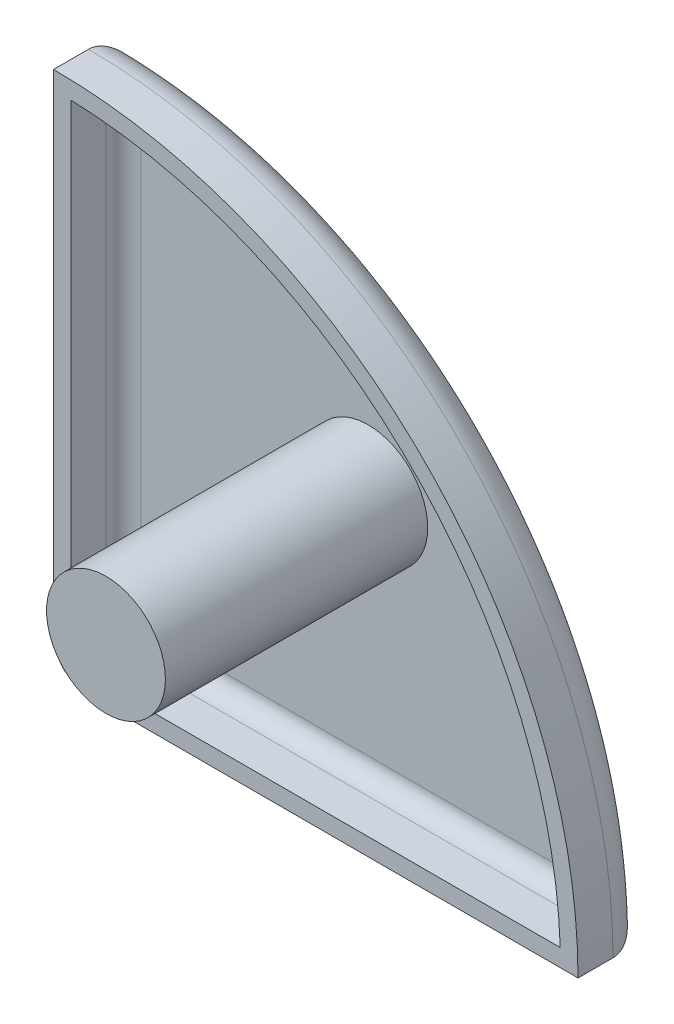
ISO-10303-21;
HEADER;
FILE_DESCRIPTION(('STEP AP214'),'2;1');
FILE_NAME('part.step','',(''),(''),'','','');
FILE_SCHEMA(('AUTOMOTIVE_DESIGN { 1 0 10303 214 1 1 1 1 }'));
ENDSEC;
DATA;
#1=APPLICATION_CONTEXT('core data for automotive mechanical design processes');
#2=APPLICATION_PROTOCOL_DEFINITION('international standard','automotive_design',2000,#1);
#3=PRODUCT_CONTEXT('',#1,'mechanical');
#4=PRODUCT('Part','Part','',(#3));
#5=PRODUCT_RELATED_PRODUCT_CATEGORY('part','',(#4));
#6=PRODUCT_DEFINITION_FORMATION('','',#4);
#7=PRODUCT_DEFINITION_CONTEXT('part definition',#1,'design');
#8=PRODUCT_DEFINITION('design','',#6,#7);
#9=PRODUCT_DEFINITION_SHAPE('','',#8);
#10=(LENGTH_UNIT() NAMED_UNIT(*) SI_UNIT(.MILLI.,.METRE.));
#11=(NAMED_UNIT(*) PLANE_ANGLE_UNIT() SI_UNIT($,.RADIAN.));
#12=(NAMED_UNIT(*) SI_UNIT($,.STERADIAN.) SOLID_ANGLE_UNIT());
#13=UNCERTAINTY_MEASURE_WITH_UNIT(LENGTH_MEASURE(1.E-05),#10,'distance_accuracy_value','');
#14=(GEOMETRIC_REPRESENTATION_CONTEXT(3) GLOBAL_UNCERTAINTY_ASSIGNED_CONTEXT((#13)) GLOBAL_UNIT_ASSIGNED_CONTEXT((#10,
#11,#12)) REPRESENTATION_CONTEXT('',''));
#15=CARTESIAN_POINT('',(0.,0.,0.));
#16=DIRECTION('',(0.,0.,1.));
#17=DIRECTION('',(1.,0.,0.));
#18=AXIS2_PLACEMENT_3D('',#15,#16,#17);
#19=CARTESIAN_POINT('',(15.,-15.,1.));
#20=DIRECTION('',(0.,0.,1.));
#21=DIRECTION('',(1.,0.,0.));
#22=AXIS2_PLACEMENT_3D('',#19,#20,#21);
#23=PLANE('',#22);
#24=CARTESIAN_POINT('',(-15.,-15.,1.));
#25=DIRECTION('',(0.,0.,1.));
#26=DIRECTION('',(1.,0.,0.));
#27=AXIS2_PLACEMENT_3D('',#24,#25,#26);
#28=CIRCLE('',#27,28.);
#29=CARTESIAN_POINT('',(-13.,12.9284800875379,1.));
#30=VERTEX_POINT('',#29);
#31=CARTESIAN_POINT('',(12.9284800875379,-13.,1.));
#32=VERTEX_POINT('',#31);
#33=EDGE_CURVE('E447',#30,#32,#28,.F.);
#34=ORIENTED_EDGE('',*,*,#33,.F.);
#35=DIRECTION('',(0.,1.,0.));
#36=VECTOR('',#35,1.);
#37=CARTESIAN_POINT('',(-13.,-15.,1.));
#38=LINE('',#37,#36);
#39=CARTESIAN_POINT('',(-13.,-13.,1.));
#40=VERTEX_POINT('',#39);
#41=EDGE_CURVE('E161',#40,#30,#38,.T.);
#42=ORIENTED_EDGE('',*,*,#41,.F.);
#43=DIRECTION('',(1.,0.,0.));
#44=VECTOR('',#43,1.);
#45=CARTESIAN_POINT('',(15.,-13.,1.));
#46=LINE('',#45,#44);
#47=EDGE_CURVE('E443',#32,#40,#46,.F.);
#48=ORIENTED_EDGE('',*,*,#47,.F.);
#49=EDGE_LOOP('',(#34,#42,#48));
#50=FACE_BOUND('',#49,.T.);
#51=CARTESIAN_POINT('',(0.,0.,1.));
#52=DIRECTION('',(0.,0.,1.));
#53=DIRECTION('',(1.,0.,0.));
#54=AXIS2_PLACEMENT_3D('',#51,#52,#53);
#55=CIRCLE('',#54,3.4);
#56=CARTESIAN_POINT('',(3.4,0.,1.));
#57=VERTEX_POINT('',#56);
#58=EDGE_CURVE('E434',#57,#57,#55,.T.);
#59=ORIENTED_EDGE('',*,*,#58,.F.);
#60=EDGE_LOOP('',(#59));
#61=FACE_BOUND('',#60,.T.);
#62=ADVANCED_FACE('F31',(#50,#61),#23,.T.);
#63=CARTESIAN_POINT('',(-15.,15.,4.));
#64=DIRECTION('',(1.,0.,0.));
#65=DIRECTION('',(0.,1.,0.));
#66=AXIS2_PLACEMENT_3D('',#63,#64,#65);
#67=PLANE('',#66);
#68=DIRECTION('',(0.,0.,-1.));
#69=VECTOR('',#68,1.);
#70=CARTESIAN_POINT('',(-15.,15.,4.));
#71=LINE('',#70,#69);
#72=CARTESIAN_POINT('',(-15.,15.,4.));
#73=VERTEX_POINT('',#72);
#74=CARTESIAN_POINT('',(-15.,15.,2.));
#75=VERTEX_POINT('',#74);
#76=EDGE_CURVE('E203',#73,#75,#71,.T.);
#77=ORIENTED_EDGE('',*,*,#76,.T.);
#78=DIRECTION('',(0.,-1.,0.));
#79=VECTOR('',#78,1.);
#80=CARTESIAN_POINT('',(-15.,15.,2.));
#81=LINE('',#80,#79);
#82=CARTESIAN_POINT('',(-15.,-13.,2.));
#83=VERTEX_POINT('',#82);
#84=EDGE_CURVE('E40',#75,#83,#81,.T.);
#85=ORIENTED_EDGE('',*,*,#84,.T.);
#86=DIRECTION('',(0.,0.,-1.));
#87=VECTOR('',#86,1.);
#88=CARTESIAN_POINT('',(-15.,-13.,4.));
#89=LINE('',#88,#87);
#90=CARTESIAN_POINT('',(-15.,-13.,4.));
#91=VERTEX_POINT('',#90);
#92=EDGE_CURVE('E219',#83,#91,#89,.F.);
#93=ORIENTED_EDGE('',*,*,#92,.T.);
#94=DIRECTION('',(0.,-1.,0.));
#95=VECTOR('',#94,1.);
#96=CARTESIAN_POINT('',(-15.,15.,4.));
#97=LINE('',#96,#95);
#98=EDGE_CURVE('E195',#73,#91,#97,.T.);
#99=ORIENTED_EDGE('',*,*,#98,.F.);
#100=EDGE_LOOP('',(#77,#85,#93,#99));
#101=FACE_BOUND('',#100,.T.);
#102=ADVANCED_FACE('F277',(#101),#67,.F.);
#103=CARTESIAN_POINT('',(-15.,-15.,4.));
#104=DIRECTION('',(0.,1.,0.));
#105=DIRECTION('',(0.,0.,1.));
#106=AXIS2_PLACEMENT_3D('',#103,#104,#105);
#107=PLANE('',#106);
#108=DIRECTION('',(0.,0.,-1.));
#109=VECTOR('',#108,1.);
#110=CARTESIAN_POINT('',(-13.,-15.,4.));
#111=LINE('',#110,#109);
#112=CARTESIAN_POINT('',(-13.,-15.,4.));
#113=VERTEX_POINT('',#112);
#114=CARTESIAN_POINT('',(-13.,-15.,2.));
#115=VERTEX_POINT('',#114);
#116=EDGE_CURVE('E205',#113,#115,#111,.T.);
#117=ORIENTED_EDGE('',*,*,#116,.T.);
#118=DIRECTION('',(1.,0.,0.));
#119=VECTOR('',#118,1.);
#120=CARTESIAN_POINT('',(-15.,-15.,2.));
#121=LINE('',#120,#119);
#122=CARTESIAN_POINT('',(15.,-15.,2.));
#123=VERTEX_POINT('',#122);
#124=EDGE_CURVE('E207',#115,#123,#121,.T.);
#125=ORIENTED_EDGE('',*,*,#124,.T.);
#126=DIRECTION('',(0.,0.,-1.));
#127=VECTOR('',#126,1.);
#128=CARTESIAN_POINT('',(15.,-15.,4.));
#129=LINE('',#128,#127);
#130=CARTESIAN_POINT('',(15.,-15.,4.));
#131=VERTEX_POINT('',#130);
#132=EDGE_CURVE('E200',#131,#123,#129,.T.);
#133=ORIENTED_EDGE('',*,*,#132,.F.);
#134=DIRECTION('',(1.,0.,0.));
#135=VECTOR('',#134,1.);
#136=CARTESIAN_POINT('',(-15.,-15.,4.));
#137=LINE('',#136,#135);
#138=EDGE_CURVE('E198',#113,#131,#137,.T.);
#139=ORIENTED_EDGE('',*,*,#138,.F.);
#140=EDGE_LOOP('',(#117,#125,#133,#139));
#141=FACE_BOUND('',#140,.T.);
#142=ADVANCED_FACE('F268',(#141),#107,.F.);
#143=CARTESIAN_POINT('',(15.,-15.,4.));
#144=DIRECTION('',(0.,0.,1.));
#145=DIRECTION('',(1.,0.,0.));
#146=AXIS2_PLACEMENT_3D('',#143,#144,#145);
#147=PLANE('',#146);
#148=DIRECTION('',(0.,-1.,0.));
#149=VECTOR('',#148,1.);
#150=CARTESIAN_POINT('',(-14.,15.,4.));
#151=LINE('',#150,#149);
#152=CARTESIAN_POINT('',(-14.,13.9827534923789,4.));
#153=VERTEX_POINT('',#152);
#154=CARTESIAN_POINT('',(-14.,-13.,4.));
#155=VERTEX_POINT('',#154);
#156=EDGE_CURVE('E133',#153,#155,#151,.T.);
#157=ORIENTED_EDGE('',*,*,#156,.F.);
#158=CARTESIAN_POINT('',(-15.,-15.,4.));
#159=DIRECTION('',(0.,0.,1.));
#160=DIRECTION('',(1.,0.,0.));
#161=AXIS2_PLACEMENT_3D('',#158,#159,#160);
#162=CIRCLE('',#161,29.);
#163=CARTESIAN_POINT('',(13.9827534923789,-14.,4.));
#164=VERTEX_POINT('',#163);
#165=EDGE_CURVE('E145',#153,#164,#162,.F.);
#166=ORIENTED_EDGE('',*,*,#165,.T.);
#167=DIRECTION('',(1.,0.,0.));
#168=VECTOR('',#167,1.);
#169=CARTESIAN_POINT('',(-15.,-14.,4.));
#170=LINE('',#169,#168);
#171=CARTESIAN_POINT('',(-13.,-14.,4.));
#172=VERTEX_POINT('',#171);
#173=EDGE_CURVE('E186',#172,#164,#170,.T.);
#174=ORIENTED_EDGE('',*,*,#173,.F.);
#175=CARTESIAN_POINT('',(-13.,-13.,4.));
#176=DIRECTION('',(0.,0.,1.));
#177=DIRECTION('',(1.,0.,0.));
#178=AXIS2_PLACEMENT_3D('',#175,#176,#177);
#179=CIRCLE('',#178,1.);
#180=EDGE_CURVE('E127',#155,#172,#179,.T.);
#181=ORIENTED_EDGE('',*,*,#180,.F.);
#182=EDGE_LOOP('',(#157,#166,#174,#181));
#183=FACE_BOUND('',#182,.T.);
#184=ORIENTED_EDGE('',*,*,#98,.T.);
#185=CARTESIAN_POINT('',(-13.,-13.,4.));
#186=DIRECTION('',(0.,0.,1.));
#187=DIRECTION('',(1.,0.,0.));
#188=AXIS2_PLACEMENT_3D('',#185,#186,#187);
#189=CIRCLE('',#188,2.);
#190=EDGE_CURVE('E11',#91,#113,#189,.T.);
#191=ORIENTED_EDGE('',*,*,#190,.T.);
#192=ORIENTED_EDGE('',*,*,#138,.T.);
#193=CARTESIAN_POINT('',(-15.,-15.,4.));
#194=DIRECTION('',(0.,0.,-1.));
#195=DIRECTION('',(-1.,0.,0.));
#196=AXIS2_PLACEMENT_3D('',#193,#194,#195);
#197=CIRCLE('',#196,30.);
#198=EDGE_CURVE('E192',#73,#131,#197,.T.);
#199=ORIENTED_EDGE('',*,*,#198,.F.);
#200=EDGE_LOOP('',(#184,#191,#192,#199));
#201=FACE_BOUND('',#200,.T.);
#202=ADVANCED_FACE('F275',(#183,#201),#147,.T.);
#203=CARTESIAN_POINT('',(15.,-15.,0.));
#204=DIRECTION('',(0.,0.,1.));
#205=DIRECTION('',(1.,0.,0.));
#206=AXIS2_PLACEMENT_3D('',#203,#204,#205);
#207=PLANE('',#206);
#208=CARTESIAN_POINT('',(-15.,-15.,0.));
#209=DIRECTION('',(0.,0.,1.));
#210=DIRECTION('',(1.,0.,0.));
#211=AXIS2_PLACEMENT_3D('',#208,#209,#210);
#212=CIRCLE('',#211,28.);
#213=CARTESIAN_POINT('',(-13.,12.9284800875379,0.));
#214=VERTEX_POINT('',#213);
#215=CARTESIAN_POINT('',(12.9284800875379,-13.,0.));
#216=VERTEX_POINT('',#215);
#217=EDGE_CURVE('E212',#214,#216,#212,.F.);
#218=ORIENTED_EDGE('',*,*,#217,.T.);
#219=DIRECTION('',(1.,0.,0.));
#220=VECTOR('',#219,1.);
#221=CARTESIAN_POINT('',(15.,-13.,0.));
#222=LINE('',#221,#220);
#223=CARTESIAN_POINT('',(-13.,-13.,0.));
#224=VERTEX_POINT('',#223);
#225=EDGE_CURVE('E214',#216,#224,#222,.F.);
#226=ORIENTED_EDGE('',*,*,#225,.T.);
#227=DIRECTION('',(0.,-1.,0.));
#228=VECTOR('',#227,1.);
#229=CARTESIAN_POINT('',(-13.,-15.,0.));
#230=LINE('',#229,#228);
#231=EDGE_CURVE('E210',#224,#214,#230,.F.);
#232=ORIENTED_EDGE('',*,*,#231,.T.);
#233=EDGE_LOOP('',(#218,#226,#232));
#234=FACE_BOUND('',#233,.T.);
#235=ADVANCED_FACE('F261',(#234),#207,.F.);
#236=CARTESIAN_POINT('',(-15.,-15.,0.));
#237=DIRECTION('',(0.,0.,1.));
#238=DIRECTION('',(1.,0.,0.));
#239=AXIS2_PLACEMENT_3D('',#236,#237,#238);
#240=CYLINDRICAL_SURFACE('',#239,30.);
#241=ORIENTED_EDGE('',*,*,#132,.T.);
#242=CARTESIAN_POINT('',(-15.,-15.,2.));
#243=DIRECTION('',(0.,0.,1.));
#244=DIRECTION('',(1.,0.,0.));
#245=AXIS2_PLACEMENT_3D('',#242,#243,#244);
#246=CIRCLE('',#245,30.);
#247=EDGE_CURVE('E217',#123,#75,#246,.T.);
#248=ORIENTED_EDGE('',*,*,#247,.T.);
#249=ORIENTED_EDGE('',*,*,#76,.F.);
#250=ORIENTED_EDGE('',*,*,#198,.T.);
#251=EDGE_LOOP('',(#241,#248,#249,#250));
#252=FACE_BOUND('',#251,.T.);
#253=ADVANCED_FACE('F271',(#252),#240,.T.);
#254=CARTESIAN_POINT('',(-13.,-13.,4.));
#255=DIRECTION('',(0.,0.,-1.));
#256=DIRECTION('',(-1.,0.,0.));
#257=AXIS2_PLACEMENT_3D('',#254,#255,#256);
#258=CYLINDRICAL_SURFACE('',#257,2.);
#259=ORIENTED_EDGE('',*,*,#190,.F.);
#260=ORIENTED_EDGE('',*,*,#92,.F.);
#261=CARTESIAN_POINT('',(-13.,-13.,2.));
#262=DIRECTION('',(0.,0.,-1.));
#263=DIRECTION('',(-1.,0.,0.));
#264=AXIS2_PLACEMENT_3D('',#261,#262,#263);
#265=CIRCLE('',#264,2.);
#266=EDGE_CURVE('E248',#115,#83,#265,.T.);
#267=ORIENTED_EDGE('',*,*,#266,.F.);
#268=ORIENTED_EDGE('',*,*,#116,.F.);
#269=EDGE_LOOP('',(#259,#260,#267,#268));
#270=FACE_BOUND('',#269,.T.);
#271=ADVANCED_FACE('F33',(#270),#258,.T.);
#272=CARTESIAN_POINT('',(-13.,15.,2.));
#273=DIRECTION('',(0.,-1.,0.));
#274=DIRECTION('',(1.,0.,0.));
#275=AXIS2_PLACEMENT_3D('',#272,#273,#274);
#276=CYLINDRICAL_SURFACE('',#275,2.);
#277=CARTESIAN_POINT('',(-13.,-13.,2.));
#278=DIRECTION('',(0.,-1.,0.));
#279=DIRECTION('',(0.,0.,-1.));
#280=AXIS2_PLACEMENT_3D('',#277,#278,#279);
#281=CIRCLE('',#280,2.);
#282=EDGE_CURVE('E35',#83,#224,#281,.T.);
#283=ORIENTED_EDGE('',*,*,#282,.F.);
#284=ORIENTED_EDGE('',*,*,#84,.F.);
#285=CARTESIAN_POINT('',(-15.,15.,2.));
#286=CARTESIAN_POINT('',(-15.0000110861466,15.0000106279793,1.95527884618019));
#287=CARTESIAN_POINT('',(-14.9985003902388,14.9985003805513,1.91056600184838));
#288=CARTESIAN_POINT('',(-14.9925206871993,14.992520024999,1.82157064045717));
#289=CARTESIAN_POINT('',(-14.9880539117554,14.9880521497306,1.77728782431881));
#290=CARTESIAN_POINT('',(-14.9762961581623,14.9762873232268,1.68986265076285));
#291=CARTESIAN_POINT('',(-14.9690289739782,14.9690142065568,1.64671387184711));
#292=CARTESIAN_POINT('',(-14.9518235106189,14.9517860063456,1.56150598512919));
#293=CARTESIAN_POINT('',(-14.9418848682462,14.9418305581282,1.51944702634632));
#294=CARTESIAN_POINT('',(-14.9083877419453,14.9082558145461,1.39556704743505));
#295=CARTESIAN_POINT('',(-14.8811025957722,14.8808827345057,1.31571912575867));
#296=CARTESIAN_POINT('',(-14.8182556643424,14.8177185155214,1.16285108078328));
#297=CARTESIAN_POINT('',(-14.7826758048959,14.7819089917305,1.0898463630308));
#298=CARTESIAN_POINT('',(-14.6893599858355,14.6877852021729,0.923707311531404));
#299=CARTESIAN_POINT('',(-14.6284545481397,14.6261987430743,0.834203005448256));
#300=CARTESIAN_POINT('',(-14.4976098013461,14.4934064831683,0.670256602195913));
#301=CARTESIAN_POINT('',(-14.427653728351,14.4221828204855,0.595843130423928));
#302=CARTESIAN_POINT('',(-14.2523896421632,14.2430203221763,0.434485991683472));
#303=CARTESIAN_POINT('',(-14.1441296828784,14.1317871319644,0.354426954992875));
#304=CARTESIAN_POINT('',(-13.9209291482852,13.9010230698325,0.21985675512038));
#305=CARTESIAN_POINT('',(-13.8059793565742,13.781480704339,0.165381821981024));
#306=CARTESIAN_POINT('',(-13.5770498188848,13.5418436854438,0.0813195175633461));
#307=CARTESIAN_POINT('',(-13.463183158525,13.4219226278002,0.0509095770328931));
#308=CARTESIAN_POINT('',(-13.234741768426,13.1797645497871,0.0104484123358321));
#309=CARTESIAN_POINT('',(-13.1201688832879,13.0575325760601,0.00035706314456196));
#310=CARTESIAN_POINT('',(-13.0040682877023,12.9328498745712,3.10846682719723E-06));
#311=CARTESIAN_POINT('',(-13.002034060509,12.9306650204984,5.61533493979961E-09));
#312=CARTESIAN_POINT('',(-13.,12.9284800875379,0.));
#313=B_SPLINE_CURVE_WITH_KNOTS('',3,(#285,#286,#287,#288,#289,#290,#291,#292,#293,#294,#295,
#296,#297,#298,#299,#300,#301,#302,#303,#304,#305,#306,#307,#308,#309,#310,#311,#312),
.UNSPECIFIED.,.F.,.F.,(4,2,2,2,2,2,2,2,2,2,2,2,2,4),(0.,0.134098935404814,0.268096748334079,
0.400980282067472,0.533881891094508,0.798708113459655,1.06411687701312,1.43569690669508,
1.80797531621147,2.32909023766685,2.85094090925617,3.35407421615458,3.85621296025089,
3.86516868204514),.UNSPECIFIED.);
#314=EDGE_CURVE('E243',#214,#75,#313,.F.);
#315=ORIENTED_EDGE('',*,*,#314,.F.);
#316=ORIENTED_EDGE('',*,*,#231,.F.);
#317=EDGE_LOOP('',(#283,#284,#315,#316));
#318=FACE_BOUND('',#317,.T.);
#319=ADVANCED_FACE('F238',(#318),#276,.T.);
#320=CARTESIAN_POINT('',(-13.,-13.,2.));
#321=DIRECTION('',(0.,0.,1.));
#322=DIRECTION('',(1.,0.,0.));
#323=AXIS2_PLACEMENT_3D('',#320,#321,#322);
#324=SPHERICAL_SURFACE('',#323,2.);
#325=ORIENTED_EDGE('',*,*,#266,.T.);
#326=ORIENTED_EDGE('',*,*,#282,.T.);
#327=CARTESIAN_POINT('',(-13.,-13.,2.));
#328=DIRECTION('',(-1.,0.,0.));
#329=DIRECTION('',(0.,0.,1.));
#330=AXIS2_PLACEMENT_3D('',#327,#328,#329);
#331=CIRCLE('',#330,2.);
#332=EDGE_CURVE('E228',#115,#224,#331,.F.);
#333=ORIENTED_EDGE('',*,*,#332,.F.);
#334=EDGE_LOOP('',(#325,#326,#333));
#335=FACE_BOUND('',#334,.T.);
#336=ADVANCED_FACE('F241',(#335),#324,.T.);
#337=CARTESIAN_POINT('',(-15.,-15.,2.));
#338=DIRECTION('',(0.,0.,1.));
#339=DIRECTION('',(1.,0.,0.));
#340=AXIS2_PLACEMENT_3D('',#337,#338,#339);
#341=TOROIDAL_SURFACE('',#340,28.,2.);
#342=ORIENTED_EDGE('',*,*,#314,.T.);
#343=ORIENTED_EDGE('',*,*,#247,.F.);
#344=CARTESIAN_POINT('',(15.,-15.,2.));
#345=CARTESIAN_POINT('',(15.0000106279793,-15.0000110861466,1.95527884618019));
#346=CARTESIAN_POINT('',(14.9985003805513,-14.9985003902388,1.91056600184838));
#347=CARTESIAN_POINT('',(14.992520024999,-14.9925206871993,1.82157064045717));
#348=CARTESIAN_POINT('',(14.9880521497306,-14.9880539117554,1.77728782431881));
#349=CARTESIAN_POINT('',(14.9762873232268,-14.9762961581623,1.68986265076285));
#350=CARTESIAN_POINT('',(14.9690142065568,-14.9690289739782,1.64671387184711));
#351=CARTESIAN_POINT('',(14.9517860063455,-14.9518235106188,1.56150598512919));
#352=CARTESIAN_POINT('',(14.9418305581282,-14.9418848682462,1.51944702634632));
#353=CARTESIAN_POINT('',(14.9082558145461,-14.9083877419453,1.39556704743505));
#354=CARTESIAN_POINT('',(14.8808827345057,-14.8811025957722,1.31571912575867));
#355=CARTESIAN_POINT('',(14.8177185155214,-14.8182556643424,1.16285108078328));
#356=CARTESIAN_POINT('',(14.7819089917305,-14.7826758048959,1.0898463630308));
#357=CARTESIAN_POINT('',(14.6877852021728,-14.6893599858355,0.923707311531402));
#358=CARTESIAN_POINT('',(14.6261987430743,-14.6284545481397,0.834203005448254));
#359=CARTESIAN_POINT('',(14.4934064831683,-14.4976098013461,0.670256602195911));
#360=CARTESIAN_POINT('',(14.4221828204855,-14.427653728351,0.595843130423928));
#361=CARTESIAN_POINT('',(14.2430203221763,-14.2523896421632,0.434485991683472));
#362=CARTESIAN_POINT('',(14.1317871319644,-14.1441296828784,0.354426954992875));
#363=CARTESIAN_POINT('',(13.9010230698325,-13.9209291482852,0.21985675512038));
#364=CARTESIAN_POINT('',(13.781480704339,-13.8059793565742,0.165381821981024));
#365=CARTESIAN_POINT('',(13.5418436854438,-13.5770498188848,0.0813195175633456));
#366=CARTESIAN_POINT('',(13.4219226278002,-13.463183158525,0.0509095770328915));
#367=CARTESIAN_POINT('',(13.1797645497871,-13.234741768426,0.0104484123358322));
#368=CARTESIAN_POINT('',(13.0575325760601,-13.1201688832878,0.000357063144565046));
#369=CARTESIAN_POINT('',(12.9328498745712,-13.0040682877023,3.10846682730806E-06));
#370=CARTESIAN_POINT('',(12.9306650204984,-13.002034060509,5.61533499659396E-09));
#371=CARTESIAN_POINT('',(12.9284800875379,-13.,0.));
#372=B_SPLINE_CURVE_WITH_KNOTS('',3,(#344,#345,#346,#347,#348,#349,#350,#351,#352,#353,#354,
#355,#356,#357,#358,#359,#360,#361,#362,#363,#364,#365,#366,#367,#368,#369,#370,#371),
.UNSPECIFIED.,.F.,.F.,(4,2,2,2,2,2,2,2,2,2,2,2,2,4),(0.,0.134098935404813,0.268096748334079,
0.400980282067471,0.533881891094508,0.798708113459655,1.06411687701312,1.43569690669508,
1.80797531621148,2.32909023766685,2.85094090925617,3.35407421615457,3.85621296025089,
3.86516868204514),.UNSPECIFIED.);
#373=EDGE_CURVE('E188',#216,#123,#372,.F.);
#374=ORIENTED_EDGE('',*,*,#373,.F.);
#375=ORIENTED_EDGE('',*,*,#217,.F.);
#376=EDGE_LOOP('',(#342,#343,#374,#375));
#377=FACE_BOUND('',#376,.T.);
#378=ADVANCED_FACE('F230',(#377),#341,.T.);
#379=CARTESIAN_POINT('',(-15.,-13.,2.));
#380=DIRECTION('',(1.,0.,0.));
#381=DIRECTION('',(0.,0.,-1.));
#382=AXIS2_PLACEMENT_3D('',#379,#380,#381);
#383=CYLINDRICAL_SURFACE('',#382,2.);
#384=ORIENTED_EDGE('',*,*,#332,.T.);
#385=ORIENTED_EDGE('',*,*,#225,.F.);
#386=ORIENTED_EDGE('',*,*,#373,.T.);
#387=ORIENTED_EDGE('',*,*,#124,.F.);
#388=EDGE_LOOP('',(#384,#385,#386,#387));
#389=FACE_BOUND('',#388,.T.);
#390=ADVANCED_FACE('F233',(#389),#383,.T.);
#391=CARTESIAN_POINT('',(-14.,15.,4.));
#392=DIRECTION('',(1.,0.,0.));
#393=DIRECTION('',(0.,1.,0.));
#394=AXIS2_PLACEMENT_3D('',#391,#392,#393);
#395=PLANE('',#394);
#396=DIRECTION('',(0.,0.,1.));
#397=VECTOR('',#396,1.);
#398=CARTESIAN_POINT('',(-14.,13.9827534923789,0.));
#399=LINE('',#398,#397);
#400=CARTESIAN_POINT('',(-14.,13.9827534923802,2.00000000000717));
#401=VERTEX_POINT('',#400);
#402=EDGE_CURVE('E439',#153,#401,#399,.F.);
#403=ORIENTED_EDGE('',*,*,#402,.F.);
#404=ORIENTED_EDGE('',*,*,#156,.T.);
#405=DIRECTION('',(0.,0.,1.));
#406=VECTOR('',#405,1.);
#407=CARTESIAN_POINT('',(-14.,-13.,4.));
#408=LINE('',#407,#406);
#409=CARTESIAN_POINT('',(-14.,-13.,2.));
#410=VERTEX_POINT('',#409);
#411=EDGE_CURVE('E128',#410,#155,#408,.T.);
#412=ORIENTED_EDGE('',*,*,#411,.F.);
#413=DIRECTION('',(0.,1.,0.));
#414=VECTOR('',#413,1.);
#415=CARTESIAN_POINT('',(-14.,15.,2.));
#416=LINE('',#415,#414);
#417=EDGE_CURVE('E118',#401,#410,#416,.F.);
#418=ORIENTED_EDGE('',*,*,#417,.F.);
#419=EDGE_LOOP('',(#403,#404,#412,#418));
#420=FACE_BOUND('',#419,.T.);
#421=ADVANCED_FACE('F131',(#420),#395,.T.);
#422=CARTESIAN_POINT('',(-15.,-14.,4.));
#423=DIRECTION('',(0.,1.,0.));
#424=DIRECTION('',(0.,0.,1.));
#425=AXIS2_PLACEMENT_3D('',#422,#423,#424);
#426=PLANE('',#425);
#427=DIRECTION('',(0.,0.,1.));
#428=VECTOR('',#427,1.);
#429=CARTESIAN_POINT('',(-13.,-14.,4.));
#430=LINE('',#429,#428);
#431=CARTESIAN_POINT('',(-13.,-14.,2.));
#432=VERTEX_POINT('',#431);
#433=EDGE_CURVE('E149',#172,#432,#430,.F.);
#434=ORIENTED_EDGE('',*,*,#433,.F.);
#435=ORIENTED_EDGE('',*,*,#173,.T.);
#436=DIRECTION('',(0.,0.,1.));
#437=VECTOR('',#436,1.);
#438=CARTESIAN_POINT('',(13.9827534923789,-14.,0.));
#439=LINE('',#438,#437);
#440=CARTESIAN_POINT('',(13.9827534923789,-14.,2.00000000000717));
#441=VERTEX_POINT('',#440);
#442=EDGE_CURVE('E48',#164,#441,#439,.F.);
#443=ORIENTED_EDGE('',*,*,#442,.T.);
#444=DIRECTION('',(1.,0.,0.));
#445=VECTOR('',#444,1.);
#446=CARTESIAN_POINT('',(-15.,-14.,2.));
#447=LINE('',#446,#445);
#448=EDGE_CURVE('E153',#432,#441,#447,.T.);
#449=ORIENTED_EDGE('',*,*,#448,.F.);
#450=EDGE_LOOP('',(#434,#435,#443,#449));
#451=FACE_BOUND('',#450,.T.);
#452=ADVANCED_FACE('F293',(#451),#426,.T.);
#453=CARTESIAN_POINT('',(-15.,-15.,0.));
#454=DIRECTION('',(0.,0.,1.));
#455=DIRECTION('',(1.,0.,0.));
#456=AXIS2_PLACEMENT_3D('',#453,#454,#455);
#457=CYLINDRICAL_SURFACE('',#456,29.);
#458=ORIENTED_EDGE('',*,*,#442,.F.);
#459=ORIENTED_EDGE('',*,*,#165,.F.);
#460=ORIENTED_EDGE('',*,*,#402,.T.);
#461=CARTESIAN_POINT('',(-15.,-15.,2.));
#462=DIRECTION('',(0.,0.,1.));
#463=DIRECTION('',(1.,0.,0.));
#464=AXIS2_PLACEMENT_3D('',#461,#462,#463);
#465=CIRCLE('',#464,29.);
#466=EDGE_CURVE('E137',#441,#401,#465,.T.);
#467=ORIENTED_EDGE('',*,*,#466,.F.);
#468=EDGE_LOOP('',(#458,#459,#460,#467));
#469=FACE_BOUND('',#468,.T.);
#470=ADVANCED_FACE('F294',(#469),#457,.F.);
#471=CARTESIAN_POINT('',(-13.,-13.,4.));
#472=DIRECTION('',(0.,0.,-1.));
#473=DIRECTION('',(-1.,0.,0.));
#474=AXIS2_PLACEMENT_3D('',#471,#472,#473);
#475=CYLINDRICAL_SURFACE('',#474,1.);
#476=ORIENTED_EDGE('',*,*,#180,.T.);
#477=ORIENTED_EDGE('',*,*,#433,.T.);
#478=CARTESIAN_POINT('',(-13.,-13.,2.));
#479=DIRECTION('',(0.,0.,1.));
#480=DIRECTION('',(1.,0.,0.));
#481=AXIS2_PLACEMENT_3D('',#478,#479,#480);
#482=CIRCLE('',#481,1.);
#483=EDGE_CURVE('E142',#432,#410,#482,.F.);
#484=ORIENTED_EDGE('',*,*,#483,.T.);
#485=ORIENTED_EDGE('',*,*,#411,.T.);
#486=EDGE_LOOP('',(#476,#477,#484,#485));
#487=FACE_BOUND('',#486,.T.);
#488=ADVANCED_FACE('F147',(#487),#475,.F.);
#489=CARTESIAN_POINT('',(-13.,15.,2.));
#490=DIRECTION('',(0.,-1.,0.));
#491=DIRECTION('',(1.,0.,0.));
#492=AXIS2_PLACEMENT_3D('',#489,#490,#491);
#493=CYLINDRICAL_SURFACE('',#492,1.);
#494=CARTESIAN_POINT('',(-13.,-13.,2.));
#495=DIRECTION('',(0.,1.,0.));
#496=DIRECTION('',(-1.,0.,0.));
#497=AXIS2_PLACEMENT_3D('',#494,#495,#496);
#498=CIRCLE('',#497,1.);
#499=EDGE_CURVE('E122',#410,#40,#498,.F.);
#500=ORIENTED_EDGE('',*,*,#499,.T.);
#501=ORIENTED_EDGE('',*,*,#41,.T.);
#502=CARTESIAN_POINT('',(-13.,12.9284800875379,1.));
#503=CARTESIAN_POINT('',(-13.0014382770436,12.9300250461825,1.00000001252202));
#504=CARTESIAN_POINT('',(-13.0028766676205,12.9315699972685,1.0000031150369));
#505=CARTESIAN_POINT('',(-13.0830738667594,13.0177012460525,1.00034850891301));
#506=CARTESIAN_POINT('',(-13.1621503017444,13.1022410654915,1.00995884538849));
#507=CARTESIAN_POINT('',(-13.3187126130851,13.2688823048795,1.04870888569318));
#508=CARTESIAN_POINT('',(-13.3961926291095,13.350975111976,1.07791062085727));
#509=CARTESIAN_POINT('',(-13.5309618056028,13.4931871018794,1.14989361311556));
#510=CARTESIAN_POINT('',(-13.5891716795996,13.5543989233122,1.18874862368346));
#511=CARTESIAN_POINT('',(-13.6995324118193,13.6701106114021,1.28179327815971));
#512=CARTESIAN_POINT('',(-13.7517136512074,13.7246442244633,1.33590083624201));
#513=CARTESIAN_POINT('',(-13.8239530624323,13.7999634524958,1.431791511465));
#514=CARTESIAN_POINT('',(-13.8477102036372,13.8246965143485,1.46770995737811));
#515=CARTESIAN_POINT('',(-13.8912412616384,13.8699668078914,1.54433872285364));
#516=CARTESIAN_POINT('',(-13.9110175870089,13.8905065768218,1.58504612111339));
#517=CARTESIAN_POINT('',(-13.9455959958023,13.926390867178,1.67132346920684));
#518=CARTESIAN_POINT('',(-13.9603408715476,13.9416756531767,1.71694205342326));
#519=CARTESIAN_POINT('',(-13.9832664706828,13.9654299648305,1.81147494386508));
#520=CARTESIAN_POINT('',(-13.9914578759011,13.9739105810058,1.86038374552799));
#521=CARTESIAN_POINT('',(-13.9997867123134,13.9825329873819,1.95254606781014));
#522=CARTESIAN_POINT('',(-14.0009043460241,13.9836896579377,1.99561397774535));
#523=CARTESIAN_POINT('',(-13.9984346131384,13.981133108362,2.0599724127326));
#524=CARTESIAN_POINT('',(-13.9969071849878,13.9795520512083,2.08146204900386));
#525=CARTESIAN_POINT('',(-13.9924952215211,13.9749843440236,2.1241542566925));
#526=CARTESIAN_POINT('',(-13.9896105013056,13.9719975024872,2.14535678859361));
#527=CARTESIAN_POINT('',(-13.9860689721118,13.9683299195295,2.16633695391678));
#528=B_SPLINE_CURVE_WITH_KNOTS('',3,(#502,#503,#504,#505,#506,#507,#508,#509,#510,#511,#512,
#513,#514,#515,#516,#517,#518,#519,#520,#521,#522,#523,#524,#525,#526,#527),.UNSPECIFIED.,.F.,
.F.,(4,2,2,2,2,2,2,2,2,2,2,2,4),(0.,0.00633265502753483,0.353049987425674,0.700870328495547,
0.978545649038262,1.25475421347245,1.40328384356889,1.55172333457147,1.70179835127485,
1.85162825200142,1.98013756330397,2.04486286851523,2.10959699359755),.UNSPECIFIED.);
#529=EDGE_CURVE('E125',#30,#401,#528,.T.);
#530=ORIENTED_EDGE('',*,*,#529,.T.);
#531=ORIENTED_EDGE('',*,*,#417,.T.);
#532=EDGE_LOOP('',(#500,#501,#530,#531));
#533=FACE_BOUND('',#532,.T.);
#534=ADVANCED_FACE('F120',(#533),#493,.F.);
#535=CARTESIAN_POINT('',(-13.,-13.,2.));
#536=DIRECTION('',(0.,0.,1.));
#537=DIRECTION('',(1.,0.,0.));
#538=AXIS2_PLACEMENT_3D('',#535,#536,#537);
#539=SPHERICAL_SURFACE('',#538,1.);
#540=ORIENTED_EDGE('',*,*,#483,.F.);
#541=CARTESIAN_POINT('',(-13.,-13.,2.));
#542=DIRECTION('',(1.,0.,0.));
#543=DIRECTION('',(0.,0.,-1.));
#544=AXIS2_PLACEMENT_3D('',#541,#542,#543);
#545=CIRCLE('',#544,1.);
#546=EDGE_CURVE('E144',#432,#40,#545,.T.);
#547=ORIENTED_EDGE('',*,*,#546,.T.);
#548=ORIENTED_EDGE('',*,*,#499,.F.);
#549=EDGE_LOOP('',(#540,#547,#548));
#550=FACE_BOUND('',#549,.T.);
#551=ADVANCED_FACE('F141',(#550),#539,.F.);
#552=CARTESIAN_POINT('',(-15.,-15.,2.));
#553=DIRECTION('',(0.,0.,1.));
#554=DIRECTION('',(1.,0.,0.));
#555=AXIS2_PLACEMENT_3D('',#552,#553,#554);
#556=TOROIDAL_SURFACE('',#555,28.,1.);
#557=ORIENTED_EDGE('',*,*,#529,.F.);
#558=ORIENTED_EDGE('',*,*,#33,.T.);
#559=CARTESIAN_POINT('',(12.9284800875379,-13.,1.));
#560=CARTESIAN_POINT('',(12.9300250461825,-13.0014382770436,1.00000001252202));
#561=CARTESIAN_POINT('',(12.9315699972685,-13.0028766676205,1.0000031150369));
#562=CARTESIAN_POINT('',(13.0177012460525,-13.0830738667594,1.00034850891301));
#563=CARTESIAN_POINT('',(13.1022410654915,-13.1621503017444,1.0099588453885));
#564=CARTESIAN_POINT('',(13.2688823048795,-13.3187126130852,1.04870888569319));
#565=CARTESIAN_POINT('',(13.3509751119761,-13.3961926291095,1.07791062085728));
#566=CARTESIAN_POINT('',(13.4931871018795,-13.5309618056028,1.14989361311559));
#567=CARTESIAN_POINT('',(13.5543989233122,-13.5891716795996,1.18874862368349));
#568=CARTESIAN_POINT('',(13.6701106114021,-13.6995324118193,1.28179327815973));
#569=CARTESIAN_POINT('',(13.7246442244633,-13.7517136512074,1.33590083624202));
#570=CARTESIAN_POINT('',(13.7999634524958,-13.8239530624323,1.43179151146499));
#571=CARTESIAN_POINT('',(13.8246965143485,-13.8477102036372,1.46770995737811));
#572=CARTESIAN_POINT('',(13.8699668078914,-13.8912412616384,1.54433872285364));
#573=CARTESIAN_POINT('',(13.8905065768218,-13.9110175870089,1.58504612111339));
#574=CARTESIAN_POINT('',(13.926390867178,-13.9455959958023,1.67132346920684));
#575=CARTESIAN_POINT('',(13.9416756531767,-13.9603408715476,1.71694205342326));
#576=CARTESIAN_POINT('',(13.9654299648305,-13.9832664706828,1.81147494386508));
#577=CARTESIAN_POINT('',(13.9739105810058,-13.9914578759011,1.86038374552799));
#578=CARTESIAN_POINT('',(13.9825329873819,-13.9997867123133,1.95254606781014));
#579=CARTESIAN_POINT('',(13.9836896579377,-14.0009043460241,1.99561397774535));
#580=CARTESIAN_POINT('',(13.981133108362,-13.9984346131384,2.0599724127326));
#581=CARTESIAN_POINT('',(13.9795520512083,-13.9969071849878,2.08146204900386));
#582=CARTESIAN_POINT('',(13.9749843440236,-13.9924952215211,2.1241542566925));
#583=CARTESIAN_POINT('',(13.9719975024872,-13.9896105013056,2.14535678859361));
#584=CARTESIAN_POINT('',(13.9683299195295,-13.9860689721118,2.16633695391678));
#585=B_SPLINE_CURVE_WITH_KNOTS('',3,(#559,#560,#561,#562,#563,#564,#565,#566,#567,#568,#569,
#570,#571,#572,#573,#574,#575,#576,#577,#578,#579,#580,#581,#582,#583,#584),.UNSPECIFIED.,.F.,
.F.,(4,2,2,2,2,2,2,2,2,2,2,2,4),(0.,0.00633265502753492,0.353049987425715,0.700870328495633,
0.978545649038306,1.25475421347245,1.40328384356888,1.55172333457146,1.70179835127485,
1.85162825200142,1.98013756330397,2.04486286851523,2.10959699359755),.UNSPECIFIED.);
#586=EDGE_CURVE('E177',#32,#441,#585,.T.);
#587=ORIENTED_EDGE('',*,*,#586,.T.);
#588=ORIENTED_EDGE('',*,*,#466,.T.);
#589=EDGE_LOOP('',(#557,#558,#587,#588));
#590=FACE_BOUND('',#589,.T.);
#591=ADVANCED_FACE('F163',(#590),#556,.F.);
#592=CARTESIAN_POINT('',(-15.,-13.,2.));
#593=DIRECTION('',(1.,0.,0.));
#594=DIRECTION('',(0.,0.,-1.));
#595=AXIS2_PLACEMENT_3D('',#592,#593,#594);
#596=CYLINDRICAL_SURFACE('',#595,1.);
#597=ORIENTED_EDGE('',*,*,#546,.F.);
#598=ORIENTED_EDGE('',*,*,#448,.T.);
#599=ORIENTED_EDGE('',*,*,#586,.F.);
#600=ORIENTED_EDGE('',*,*,#47,.T.);
#601=EDGE_LOOP('',(#597,#598,#599,#600));
#602=FACE_BOUND('',#601,.T.);
#603=ADVANCED_FACE('F169',(#602),#596,.F.);
#604=CARTESIAN_POINT('',(0.,0.,16.));
#605=DIRECTION('',(0.,0.,-1.));
#606=DIRECTION('',(-1.,0.,0.));
#607=AXIS2_PLACEMENT_3D('',#604,#605,#606);
#608=CYLINDRICAL_SURFACE('',#607,3.4);
#609=CARTESIAN_POINT('',(0.,0.,16.));
#610=DIRECTION('',(0.,0.,1.));
#611=DIRECTION('',(1.,0.,0.));
#612=AXIS2_PLACEMENT_3D('',#609,#610,#611);
#613=CIRCLE('',#612,3.4);
#614=CARTESIAN_POINT('',(3.4,0.,16.));
#615=VERTEX_POINT('',#614);
#616=EDGE_CURVE('E183',#615,#615,#613,.T.);
#617=ORIENTED_EDGE('',*,*,#616,.F.);
#618=EDGE_LOOP('',(#617));
#619=FACE_BOUND('',#618,.T.);
#620=ORIENTED_EDGE('',*,*,#58,.T.);
#621=EDGE_LOOP('',(#620));
#622=FACE_BOUND('',#621,.T.);
#623=ADVANCED_FACE('F173',(#619,#622),#608,.T.);
#624=CARTESIAN_POINT('',(0.,0.,16.));
#625=DIRECTION('',(0.,0.,1.));
#626=DIRECTION('',(1.,0.,0.));
#627=AXIS2_PLACEMENT_3D('',#624,#625,#626);
#628=PLANE('',#627);
#629=ORIENTED_EDGE('',*,*,#616,.T.);
#630=EDGE_LOOP('',(#629));
#631=FACE_BOUND('',#630,.T.);
#632=ADVANCED_FACE('F398',(#631),#628,.T.);
#633=CLOSED_SHELL('',(#62,#102,#142,#202,#235,#253,#271,#319,#336,#378,#390,#421,#452,#470,#488,
#534,#551,#591,#603,#623,#632));
#634=MANIFOLD_SOLID_BREP('B2',#633);
#635=ADVANCED_BREP_SHAPE_REPRESENTATION('',(#18,#634),#14);
#636=SHAPE_DEFINITION_REPRESENTATION(#9,#635);
ENDSEC;
END-ISO-10303-21;
